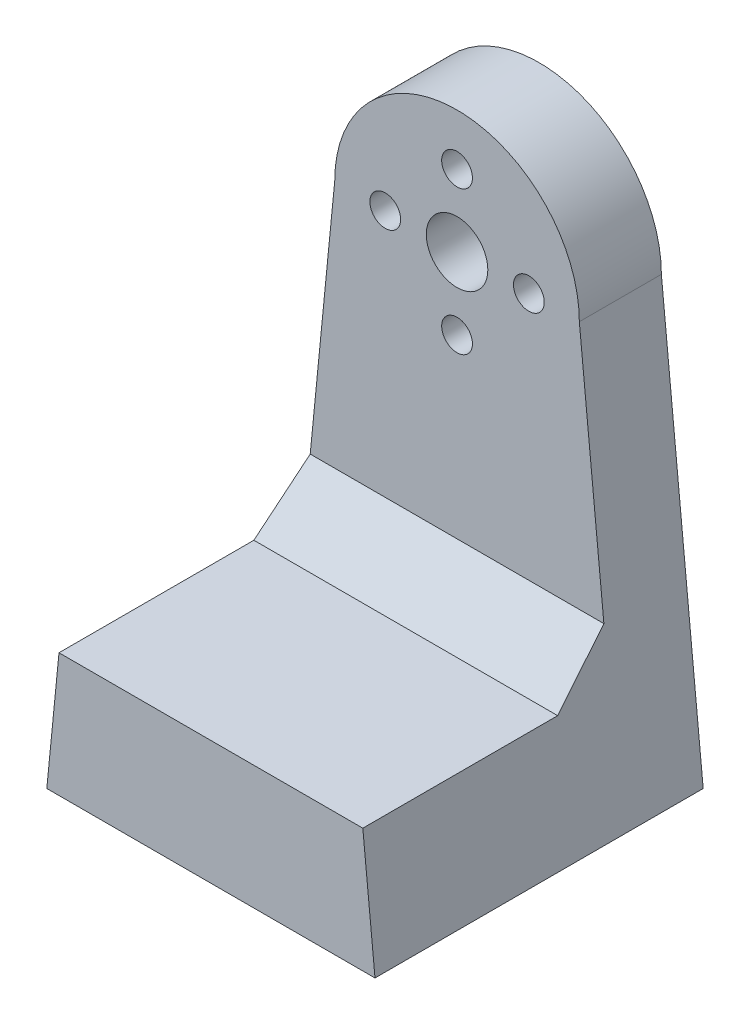
ISO-10303-21;
HEADER;
FILE_DESCRIPTION(('STEP AP214'),'2;1');
FILE_NAME('part.step','',(''),(''),'','','');
FILE_SCHEMA(('AUTOMOTIVE_DESIGN { 1 0 10303 214 1 1 1 1 }'));
ENDSEC;
DATA;
#1=APPLICATION_CONTEXT('core data for automotive mechanical design processes');
#2=APPLICATION_PROTOCOL_DEFINITION('international standard','automotive_design',2000,#1);
#3=PRODUCT_CONTEXT('',#1,'mechanical');
#4=PRODUCT('Part','Part','',(#3));
#5=PRODUCT_RELATED_PRODUCT_CATEGORY('part','',(#4));
#6=PRODUCT_DEFINITION_FORMATION('','',#4);
#7=PRODUCT_DEFINITION_CONTEXT('part definition',#1,'design');
#8=PRODUCT_DEFINITION('design','',#6,#7);
#9=PRODUCT_DEFINITION_SHAPE('','',#8);
#10=(LENGTH_UNIT() NAMED_UNIT(*) SI_UNIT(.MILLI.,.METRE.));
#11=(NAMED_UNIT(*) PLANE_ANGLE_UNIT() SI_UNIT($,.RADIAN.));
#12=(NAMED_UNIT(*) SI_UNIT($,.STERADIAN.) SOLID_ANGLE_UNIT());
#13=UNCERTAINTY_MEASURE_WITH_UNIT(LENGTH_MEASURE(1.E-05),#10,'distance_accuracy_value','');
#14=(GEOMETRIC_REPRESENTATION_CONTEXT(3) GLOBAL_UNCERTAINTY_ASSIGNED_CONTEXT((#13)) GLOBAL_UNIT_ASSIGNED_CONTEXT((#10,
#11,#12)) REPRESENTATION_CONTEXT('',''));
#15=CARTESIAN_POINT('',(0.,0.,0.));
#16=DIRECTION('',(0.,0.,1.));
#17=DIRECTION('',(1.,0.,0.));
#18=AXIS2_PLACEMENT_3D('',#15,#16,#17);
#19=CARTESIAN_POINT('',(-16.,42.,-16.));
#20=DIRECTION('',(0.,0.,1.));
#21=DIRECTION('',(1.,0.,0.));
#22=AXIS2_PLACEMENT_3D('',#19,#20,#21);
#23=PLANE('',#22);
#24=CARTESIAN_POINT('',(1.18218714507213E-06,48.2985575819751,-16.));
#25=DIRECTION('',(0.,0.,1.));
#26=DIRECTION('',(1.,0.,0.));
#27=AXIS2_PLACEMENT_3D('',#24,#25,#26);
#28=CIRCLE('',#27,1.5);
#29=CARTESIAN_POINT('',(1.50000118218715,48.2985575819751,-16.));
#30=VERTEX_POINT('',#29);
#31=EDGE_CURVE('E170',#30,#30,#28,.T.);
#32=ORIENTED_EDGE('',*,*,#31,.T.);
#33=EDGE_LOOP('',(#32));
#34=FACE_BOUND('',#33,.T.);
#35=CARTESIAN_POINT('',(7.00000000000006,41.2985563997881,-16.));
#36=DIRECTION('',(0.,0.,1.));
#37=DIRECTION('',(1.,0.,0.));
#38=AXIS2_PLACEMENT_3D('',#35,#36,#37);
#39=CIRCLE('',#38,1.5);
#40=CARTESIAN_POINT('',(8.50000000000006,41.2985563997881,-16.));
#41=VERTEX_POINT('',#40);
#42=EDGE_CURVE('E174',#41,#41,#39,.T.);
#43=ORIENTED_EDGE('',*,*,#42,.T.);
#44=EDGE_LOOP('',(#43));
#45=FACE_BOUND('',#44,.T.);
#46=CARTESIAN_POINT('',(-1.18218703128512E-06,34.2985575819751,-16.));
#47=DIRECTION('',(0.,0.,1.));
#48=DIRECTION('',(1.,0.,0.));
#49=AXIS2_PLACEMENT_3D('',#46,#47,#48);
#50=CIRCLE('',#49,1.5);
#51=CARTESIAN_POINT('',(1.49999881781297,34.2985575819751,-16.));
#52=VERTEX_POINT('',#51);
#53=EDGE_CURVE('E178',#52,#52,#50,.T.);
#54=ORIENTED_EDGE('',*,*,#53,.T.);
#55=EDGE_LOOP('',(#54));
#56=FACE_BOUND('',#55,.T.);
#57=CARTESIAN_POINT('',(-6.99999999999994,41.2985587641622,-16.));
#58=DIRECTION('',(0.,0.,1.));
#59=DIRECTION('',(1.,0.,0.));
#60=AXIS2_PLACEMENT_3D('',#57,#58,#59);
#61=CIRCLE('',#60,1.5);
#62=CARTESIAN_POINT('',(-5.49999999999994,41.2985587641622,-16.));
#63=VERTEX_POINT('',#62);
#64=EDGE_CURVE('E182',#63,#63,#61,.T.);
#65=ORIENTED_EDGE('',*,*,#64,.T.);
#66=EDGE_LOOP('',(#65));
#67=FACE_BOUND('',#66,.T.);
#68=CARTESIAN_POINT('',(0.,41.2985575819751,-16.));
#69=DIRECTION('',(0.,0.,1.));
#70=DIRECTION('',(1.,0.,0.));
#71=AXIS2_PLACEMENT_3D('',#68,#69,#70);
#72=CIRCLE('',#71,3.);
#73=CARTESIAN_POINT('',(3.00000000000006,41.2985575819751,-16.));
#74=VERTEX_POINT('',#73);
#75=EDGE_CURVE('E117',#74,#74,#72,.T.);
#76=ORIENTED_EDGE('',*,*,#75,.T.);
#77=EDGE_LOOP('',(#76));
#78=FACE_BOUND('',#77,.T.);
#79=DIRECTION('',(0.098069247945612,0.995179593142555,0.));
#80=VECTOR('',#79,1.);
#81=CARTESIAN_POINT('',(-16.,0.,-16.));
#82=LINE('',#81,#80);
#83=CARTESIAN_POINT('',(-16.,0.,-16.));
#84=VERTEX_POINT('',#83);
#85=CARTESIAN_POINT('',(-11.9226403852054,41.3759171967699,-16.));
#86=VERTEX_POINT('',#85);
#87=EDGE_CURVE('E110',#84,#86,#82,.T.);
#88=ORIENTED_EDGE('',*,*,#87,.T.);
#89=CARTESIAN_POINT('',(-1.59594559789866E-13,41.3759171967699,-16.));
#90=DIRECTION('',(0.,0.,-1.));
#91=DIRECTION('',(-1.,0.,0.));
#92=AXIS2_PLACEMENT_3D('',#89,#90,#91);
#93=CIRCLE('',#92,11.9226403852053);
#94=CARTESIAN_POINT('',(11.9226403852051,41.3759171967699,-16.));
#95=VERTEX_POINT('',#94);
#96=EDGE_CURVE('E108',#86,#95,#93,.T.);
#97=ORIENTED_EDGE('',*,*,#96,.T.);
#98=DIRECTION('',(0.0980692479456193,-0.995179593142555,0.));
#99=VECTOR('',#98,1.);
#100=CARTESIAN_POINT('',(16.,0.,-16.));
#101=LINE('',#100,#99);
#102=CARTESIAN_POINT('',(16.,0.,-16.));
#103=VERTEX_POINT('',#102);
#104=EDGE_CURVE('E48',#95,#103,#101,.T.);
#105=ORIENTED_EDGE('',*,*,#104,.T.);
#106=DIRECTION('',(-1.,0.,0.));
#107=VECTOR('',#106,1.);
#108=CARTESIAN_POINT('',(-16.,0.,-16.));
#109=LINE('',#108,#107);
#110=EDGE_CURVE('E147',#103,#84,#109,.T.);
#111=ORIENTED_EDGE('',*,*,#110,.T.);
#112=EDGE_LOOP('',(#88,#97,#105,#111));
#113=FACE_BOUND('',#112,.T.);
#114=ADVANCED_FACE('F34',(#34,#45,#56,#67,#78,#113),#23,.F.);
#115=CARTESIAN_POINT('',(-16.,42.,16.));
#116=DIRECTION('',(0.,0.,-1.));
#117=DIRECTION('',(-1.,0.,0.));
#118=AXIS2_PLACEMENT_3D('',#115,#116,#117);
#119=PLANE('',#118);
#120=DIRECTION('',(1.,0.,0.));
#121=VECTOR('',#120,1.);
#122=CARTESIAN_POINT('',(-26.,12.058,16.));
#123=LINE('',#122,#121);
#124=CARTESIAN_POINT('',(-14.8117531751289,12.058,16.));
#125=VERTEX_POINT('',#124);
#126=CARTESIAN_POINT('',(14.8117531751288,12.058,16.));
#127=VERTEX_POINT('',#126);
#128=EDGE_CURVE('E137',#125,#127,#123,.T.);
#129=ORIENTED_EDGE('',*,*,#128,.F.);
#130=DIRECTION('',(0.098069247945612,0.995179593142555,0.));
#131=VECTOR('',#130,1.);
#132=CARTESIAN_POINT('',(-16.,0.,16.));
#133=LINE('',#132,#131);
#134=CARTESIAN_POINT('',(-16.,0.,16.));
#135=VERTEX_POINT('',#134);
#136=EDGE_CURVE('E124',#135,#125,#133,.T.);
#137=ORIENTED_EDGE('',*,*,#136,.F.);
#138=DIRECTION('',(1.,0.,0.));
#139=VECTOR('',#138,1.);
#140=CARTESIAN_POINT('',(-16.,0.,16.));
#141=LINE('',#140,#139);
#142=CARTESIAN_POINT('',(16.,0.,16.));
#143=VERTEX_POINT('',#142);
#144=EDGE_CURVE('E11',#135,#143,#141,.T.);
#145=ORIENTED_EDGE('',*,*,#144,.T.);
#146=DIRECTION('',(0.0980692479456193,-0.995179593142555,0.));
#147=VECTOR('',#146,1.);
#148=CARTESIAN_POINT('',(16.,0.,16.));
#149=LINE('',#148,#147);
#150=EDGE_CURVE('E114',#127,#143,#149,.T.);
#151=ORIENTED_EDGE('',*,*,#150,.F.);
#152=EDGE_LOOP('',(#129,#137,#145,#151));
#153=FACE_BOUND('',#152,.T.);
#154=ADVANCED_FACE('F156',(#153),#119,.F.);
#155=CARTESIAN_POINT('',(0.,0.,0.));
#156=DIRECTION('',(0.,-1.,0.));
#157=DIRECTION('',(0.,0.,-1.));
#158=AXIS2_PLACEMENT_3D('',#155,#156,#157);
#159=PLANE('',#158);
#160=CARTESIAN_POINT('',(-8.,0.,7.5));
#161=DIRECTION('',(0.,-1.,0.));
#162=DIRECTION('',(0.,0.,-1.));
#163=AXIS2_PLACEMENT_3D('',#160,#161,#162);
#164=CIRCLE('',#163,2.05);
#165=CARTESIAN_POINT('',(-8.,0.,5.45));
#166=VERTEX_POINT('',#165);
#167=EDGE_CURVE('E211',#166,#166,#164,.T.);
#168=ORIENTED_EDGE('',*,*,#167,.F.);
#169=EDGE_LOOP('',(#168));
#170=FACE_BOUND('',#169,.T.);
#171=CARTESIAN_POINT('',(8.,0.,7.5));
#172=DIRECTION('',(0.,-1.,0.));
#173=DIRECTION('',(0.,0.,-1.));
#174=AXIS2_PLACEMENT_3D('',#171,#172,#173);
#175=CIRCLE('',#174,2.05);
#176=CARTESIAN_POINT('',(8.,0.,5.45));
#177=VERTEX_POINT('',#176);
#178=EDGE_CURVE('E205',#177,#177,#175,.T.);
#179=ORIENTED_EDGE('',*,*,#178,.F.);
#180=EDGE_LOOP('',(#179));
#181=FACE_BOUND('',#180,.T.);
#182=DIRECTION('',(0.,0.,-1.));
#183=VECTOR('',#182,1.);
#184=CARTESIAN_POINT('',(16.,0.,16.));
#185=LINE('',#184,#183);
#186=EDGE_CURVE('E140',#143,#103,#185,.T.);
#187=ORIENTED_EDGE('',*,*,#186,.F.);
#188=ORIENTED_EDGE('',*,*,#144,.F.);
#189=DIRECTION('',(0.,0.,1.));
#190=VECTOR('',#189,1.);
#191=CARTESIAN_POINT('',(-16.,0.,16.));
#192=LINE('',#191,#190);
#193=EDGE_CURVE('E41',#84,#135,#192,.T.);
#194=ORIENTED_EDGE('',*,*,#193,.F.);
#195=ORIENTED_EDGE('',*,*,#110,.F.);
#196=EDGE_LOOP('',(#187,#188,#194,#195));
#197=FACE_BOUND('',#196,.T.);
#198=ADVANCED_FACE('F159',(#170,#181,#197),#159,.T.);
#199=CARTESIAN_POINT('',(-26.,12.058,-3.));
#200=DIRECTION('',(0.,-0.705417607223476,-0.708791929566855));
#201=DIRECTION('',(0.,0.708791929566855,-0.705417607223476));
#202=AXIS2_PLACEMENT_3D('',#199,#200,#201);
#203=PLANE('',#202);
#204=DIRECTION('',(1.,0.,0.));
#205=VECTOR('',#204,1.);
#206=CARTESIAN_POINT('',(-26.,17.0819171967699,-8.));
#207=LINE('',#206,#205);
#208=CARTESIAN_POINT('',(-14.3166749152618,17.0819171967699,-8.));
#209=VERTEX_POINT('',#208);
#210=CARTESIAN_POINT('',(14.3166749152617,17.0819171967699,-8.));
#211=VERTEX_POINT('',#210);
#212=EDGE_CURVE('E138',#209,#211,#207,.T.);
#213=ORIENTED_EDGE('',*,*,#212,.F.);
#214=DIRECTION('',(-0.0696776244724187,-0.707069253881273,0.703703132623169));
#215=VECTOR('',#214,1.);
#216=CARTESIAN_POINT('',(-14.8660717929441,11.5067896959568,-2.451413824657));
#217=LINE('',#216,#215);
#218=CARTESIAN_POINT('',(-14.8117531751289,12.058,-3.));
#219=VERTEX_POINT('',#218);
#220=EDGE_CURVE('E95',#209,#219,#217,.T.);
#221=ORIENTED_EDGE('',*,*,#220,.T.);
#222=DIRECTION('',(1.,0.,0.));
#223=VECTOR('',#222,1.);
#224=CARTESIAN_POINT('',(-26.,12.058,-3.));
#225=LINE('',#224,#223);
#226=CARTESIAN_POINT('',(14.8117531751288,12.058,-3.));
#227=VERTEX_POINT('',#226);
#228=EDGE_CURVE('E141',#219,#227,#225,.T.);
#229=ORIENTED_EDGE('',*,*,#228,.T.);
#230=DIRECTION('',(-0.069677624472424,0.707069253881272,-0.703703132623168));
#231=VECTOR('',#230,1.);
#232=CARTESIAN_POINT('',(14.6136132826337,14.0686688052495,-5.0010966806362));
#233=LINE('',#232,#231);
#234=EDGE_CURVE('E130',#227,#211,#233,.T.);
#235=ORIENTED_EDGE('',*,*,#234,.T.);
#236=EDGE_LOOP('',(#213,#221,#229,#235));
#237=FACE_BOUND('',#236,.T.);
#238=ADVANCED_FACE('F228',(#237),#203,.F.);
#239=CARTESIAN_POINT('',(-26.,12.058,16.));
#240=DIRECTION('',(0.,-1.,0.));
#241=DIRECTION('',(0.,0.,-1.));
#242=AXIS2_PLACEMENT_3D('',#239,#240,#241);
#243=PLANE('',#242);
#244=ORIENTED_EDGE('',*,*,#228,.F.);
#245=DIRECTION('',(0.,0.,1.));
#246=VECTOR('',#245,1.);
#247=CARTESIAN_POINT('',(-14.8117531751289,12.058,16.));
#248=LINE('',#247,#246);
#249=EDGE_CURVE('E56',#219,#125,#248,.T.);
#250=ORIENTED_EDGE('',*,*,#249,.T.);
#251=ORIENTED_EDGE('',*,*,#128,.T.);
#252=DIRECTION('',(0.,0.,-1.));
#253=VECTOR('',#252,1.);
#254=CARTESIAN_POINT('',(14.8117531751288,12.058,16.));
#255=LINE('',#254,#253);
#256=EDGE_CURVE('E100',#127,#227,#255,.T.);
#257=ORIENTED_EDGE('',*,*,#256,.T.);
#258=EDGE_LOOP('',(#244,#250,#251,#257));
#259=FACE_BOUND('',#258,.T.);
#260=ADVANCED_FACE('F270',(#259),#243,.F.);
#261=CARTESIAN_POINT('',(-26.,17.0819171967699,-8.));
#262=DIRECTION('',(0.,0.,-1.));
#263=DIRECTION('',(-1.,0.,0.));
#264=AXIS2_PLACEMENT_3D('',#261,#262,#263);
#265=PLANE('',#264);
#266=CARTESIAN_POINT('',(1.18218714507213E-06,48.2985575819751,-8.));
#267=DIRECTION('',(0.,0.,1.));
#268=DIRECTION('',(1.,0.,0.));
#269=AXIS2_PLACEMENT_3D('',#266,#267,#268);
#270=CIRCLE('',#269,1.5);
#271=CARTESIAN_POINT('',(1.50000118218715,48.2985575819751,-8.));
#272=VERTEX_POINT('',#271);
#273=EDGE_CURVE('E192',#272,#272,#270,.T.);
#274=ORIENTED_EDGE('',*,*,#273,.F.);
#275=EDGE_LOOP('',(#274));
#276=FACE_BOUND('',#275,.T.);
#277=CARTESIAN_POINT('',(7.00000000000006,41.2985563997881,-8.));
#278=DIRECTION('',(0.,0.,1.));
#279=DIRECTION('',(1.,0.,0.));
#280=AXIS2_PLACEMENT_3D('',#277,#278,#279);
#281=CIRCLE('',#280,1.5);
#282=CARTESIAN_POINT('',(8.50000000000006,41.2985563997881,-8.));
#283=VERTEX_POINT('',#282);
#284=EDGE_CURVE('E188',#283,#283,#281,.T.);
#285=ORIENTED_EDGE('',*,*,#284,.F.);
#286=EDGE_LOOP('',(#285));
#287=FACE_BOUND('',#286,.T.);
#288=CARTESIAN_POINT('',(-1.18218703128512E-06,34.2985575819751,-8.));
#289=DIRECTION('',(0.,0.,1.));
#290=DIRECTION('',(1.,0.,0.));
#291=AXIS2_PLACEMENT_3D('',#288,#289,#290);
#292=CIRCLE('',#291,1.5);
#293=CARTESIAN_POINT('',(1.49999881781297,34.2985575819751,-8.));
#294=VERTEX_POINT('',#293);
#295=EDGE_CURVE('E201',#294,#294,#292,.T.);
#296=ORIENTED_EDGE('',*,*,#295,.F.);
#297=EDGE_LOOP('',(#296));
#298=FACE_BOUND('',#297,.T.);
#299=CARTESIAN_POINT('',(-6.99999999999994,41.2985587641622,-8.));
#300=DIRECTION('',(0.,0.,1.));
#301=DIRECTION('',(1.,0.,0.));
#302=AXIS2_PLACEMENT_3D('',#299,#300,#301);
#303=CIRCLE('',#302,1.5);
#304=CARTESIAN_POINT('',(-5.49999999999994,41.2985587641622,-8.));
#305=VERTEX_POINT('',#304);
#306=EDGE_CURVE('E196',#305,#305,#303,.T.);
#307=ORIENTED_EDGE('',*,*,#306,.F.);
#308=EDGE_LOOP('',(#307));
#309=FACE_BOUND('',#308,.T.);
#310=CARTESIAN_POINT('',(0.,41.2985575819751,-8.));
#311=DIRECTION('',(0.,0.,1.));
#312=DIRECTION('',(1.,0.,0.));
#313=AXIS2_PLACEMENT_3D('',#310,#311,#312);
#314=CIRCLE('',#313,3.);
#315=CARTESIAN_POINT('',(3.00000000000006,41.2985575819751,-8.));
#316=VERTEX_POINT('',#315);
#317=EDGE_CURVE('E120',#316,#316,#314,.T.);
#318=ORIENTED_EDGE('',*,*,#317,.F.);
#319=EDGE_LOOP('',(#318));
#320=FACE_BOUND('',#319,.T.);
#321=DIRECTION('',(-0.0980692479456194,0.995179593142555,0.));
#322=VECTOR('',#321,1.);
#323=CARTESIAN_POINT('',(13.9289261740511,21.016684135469,-8.));
#324=LINE('',#323,#322);
#325=CARTESIAN_POINT('',(11.9226403852051,41.3759171967699,-8.));
#326=VERTEX_POINT('',#325);
#327=EDGE_CURVE('E109',#211,#326,#324,.T.);
#328=ORIENTED_EDGE('',*,*,#327,.T.);
#329=CARTESIAN_POINT('',(-1.59594559789866E-13,41.3759171967699,-8.));
#330=DIRECTION('',(0.,0.,-1.));
#331=DIRECTION('',(-1.,0.,0.));
#332=AXIS2_PLACEMENT_3D('',#329,#330,#331);
#333=CIRCLE('',#332,11.9226403852053);
#334=CARTESIAN_POINT('',(-11.9226403852054,41.3759171967699,-8.));
#335=VERTEX_POINT('',#334);
#336=EDGE_CURVE('E106',#335,#326,#333,.T.);
#337=ORIENTED_EDGE('',*,*,#336,.F.);
#338=DIRECTION('',(-0.098069247945612,-0.995179593142555,0.));
#339=VECTOR('',#338,1.);
#340=CARTESIAN_POINT('',(-14.4290401984674,15.9416653934125,-8.));
#341=LINE('',#340,#339);
#342=EDGE_CURVE('E90',#335,#209,#341,.T.);
#343=ORIENTED_EDGE('',*,*,#342,.T.);
#344=ORIENTED_EDGE('',*,*,#212,.T.);
#345=EDGE_LOOP('',(#328,#337,#343,#344));
#346=FACE_BOUND('',#345,.T.);
#347=ADVANCED_FACE('F113',(#276,#287,#298,#309,#320,#346),#265,.F.);
#348=CARTESIAN_POINT('',(16.,0.,-16.));
#349=DIRECTION('',(-0.995179593142555,-0.0980692479456194,0.));
#350=DIRECTION('',(0.0980692479456194,-0.995179593142555,0.));
#351=AXIS2_PLACEMENT_3D('',#348,#349,#350);
#352=PLANE('',#351);
#353=ORIENTED_EDGE('',*,*,#150,.T.);
#354=ORIENTED_EDGE('',*,*,#186,.T.);
#355=ORIENTED_EDGE('',*,*,#104,.F.);
#356=DIRECTION('',(0.,0.,1.));
#357=VECTOR('',#356,1.);
#358=CARTESIAN_POINT('',(11.9226403852051,41.3759171967699,-16.));
#359=LINE('',#358,#357);
#360=EDGE_CURVE('E125',#95,#326,#359,.T.);
#361=ORIENTED_EDGE('',*,*,#360,.T.);
#362=ORIENTED_EDGE('',*,*,#327,.F.);
#363=ORIENTED_EDGE('',*,*,#234,.F.);
#364=ORIENTED_EDGE('',*,*,#256,.F.);
#365=EDGE_LOOP('',(#353,#354,#355,#361,#362,#363,#364));
#366=FACE_BOUND('',#365,.T.);
#367=ADVANCED_FACE('F160',(#366),#352,.F.);
#368=CARTESIAN_POINT('',(-16.,0.,-16.));
#369=DIRECTION('',(0.995179593142555,-0.098069247945612,0.));
#370=DIRECTION('',(0.098069247945612,0.995179593142556,0.));
#371=AXIS2_PLACEMENT_3D('',#368,#369,#370);
#372=PLANE('',#371);
#373=ORIENTED_EDGE('',*,*,#220,.F.);
#374=ORIENTED_EDGE('',*,*,#342,.F.);
#375=DIRECTION('',(0.,0.,1.));
#376=VECTOR('',#375,1.);
#377=CARTESIAN_POINT('',(-11.9226403852054,41.3759171967699,-16.));
#378=LINE('',#377,#376);
#379=EDGE_CURVE('E93',#86,#335,#378,.T.);
#380=ORIENTED_EDGE('',*,*,#379,.F.);
#381=ORIENTED_EDGE('',*,*,#87,.F.);
#382=ORIENTED_EDGE('',*,*,#193,.T.);
#383=ORIENTED_EDGE('',*,*,#136,.T.);
#384=ORIENTED_EDGE('',*,*,#249,.F.);
#385=EDGE_LOOP('',(#373,#374,#380,#381,#382,#383,#384));
#386=FACE_BOUND('',#385,.T.);
#387=ADVANCED_FACE('F92',(#386),#372,.F.);
#388=CARTESIAN_POINT('',(-1.59594559789866E-13,41.3759171967699,-8.));
#389=DIRECTION('',(0.,0.,-1.));
#390=DIRECTION('',(-1.,0.,0.));
#391=AXIS2_PLACEMENT_3D('',#388,#389,#390);
#392=CYLINDRICAL_SURFACE('',#391,11.9226403852053);
#393=ORIENTED_EDGE('',*,*,#360,.F.);
#394=ORIENTED_EDGE('',*,*,#96,.F.);
#395=ORIENTED_EDGE('',*,*,#379,.T.);
#396=ORIENTED_EDGE('',*,*,#336,.T.);
#397=EDGE_LOOP('',(#393,#394,#395,#396));
#398=FACE_BOUND('',#397,.T.);
#399=ADVANCED_FACE('F105',(#398),#392,.T.);
#400=CARTESIAN_POINT('',(0.,41.2985575819751,-16.));
#401=DIRECTION('',(0.,0.,1.));
#402=DIRECTION('',(1.,0.,0.));
#403=AXIS2_PLACEMENT_3D('',#400,#401,#402);
#404=CYLINDRICAL_SURFACE('',#403,3.);
#405=ORIENTED_EDGE('',*,*,#75,.F.);
#406=EDGE_LOOP('',(#405));
#407=FACE_BOUND('',#406,.T.);
#408=ORIENTED_EDGE('',*,*,#317,.T.);
#409=EDGE_LOOP('',(#408));
#410=FACE_BOUND('',#409,.T.);
#411=ADVANCED_FACE('F254',(#407,#410),#404,.F.);
#412=CARTESIAN_POINT('',(-6.99999999999994,41.2985587641622,-16.));
#413=DIRECTION('',(0.,0.,1.));
#414=DIRECTION('',(1.,0.,0.));
#415=AXIS2_PLACEMENT_3D('',#412,#413,#414);
#416=CYLINDRICAL_SURFACE('',#415,1.5);
#417=ORIENTED_EDGE('',*,*,#64,.F.);
#418=EDGE_LOOP('',(#417));
#419=FACE_BOUND('',#418,.T.);
#420=ORIENTED_EDGE('',*,*,#306,.T.);
#421=EDGE_LOOP('',(#420));
#422=FACE_BOUND('',#421,.T.);
#423=ADVANCED_FACE('F251',(#419,#422),#416,.F.);
#424=CARTESIAN_POINT('',(-1.18218703128512E-06,34.2985575819751,-16.));
#425=DIRECTION('',(0.,0.,1.));
#426=DIRECTION('',(1.,0.,0.));
#427=AXIS2_PLACEMENT_3D('',#424,#425,#426);
#428=CYLINDRICAL_SURFACE('',#427,1.5);
#429=ORIENTED_EDGE('',*,*,#53,.F.);
#430=EDGE_LOOP('',(#429));
#431=FACE_BOUND('',#430,.T.);
#432=ORIENTED_EDGE('',*,*,#295,.T.);
#433=EDGE_LOOP('',(#432));
#434=FACE_BOUND('',#433,.T.);
#435=ADVANCED_FACE('F248',(#431,#434),#428,.F.);
#436=CARTESIAN_POINT('',(7.00000000000006,41.2985563997881,-16.));
#437=DIRECTION('',(0.,0.,1.));
#438=DIRECTION('',(1.,0.,0.));
#439=AXIS2_PLACEMENT_3D('',#436,#437,#438);
#440=CYLINDRICAL_SURFACE('',#439,1.5);
#441=ORIENTED_EDGE('',*,*,#42,.F.);
#442=EDGE_LOOP('',(#441));
#443=FACE_BOUND('',#442,.T.);
#444=ORIENTED_EDGE('',*,*,#284,.T.);
#445=EDGE_LOOP('',(#444));
#446=FACE_BOUND('',#445,.T.);
#447=ADVANCED_FACE('F243',(#443,#446),#440,.F.);
#448=CARTESIAN_POINT('',(1.18218714507213E-06,48.2985575819751,-16.));
#449=DIRECTION('',(0.,0.,1.));
#450=DIRECTION('',(1.,0.,0.));
#451=AXIS2_PLACEMENT_3D('',#448,#449,#450);
#452=CYLINDRICAL_SURFACE('',#451,1.5);
#453=ORIENTED_EDGE('',*,*,#31,.F.);
#454=EDGE_LOOP('',(#453));
#455=FACE_BOUND('',#454,.T.);
#456=ORIENTED_EDGE('',*,*,#273,.T.);
#457=EDGE_LOOP('',(#456));
#458=FACE_BOUND('',#457,.T.);
#459=ADVANCED_FACE('F234',(#455,#458),#452,.F.);
#460=CARTESIAN_POINT('',(8.,6.,7.5));
#461=DIRECTION('',(0.,-1.,0.));
#462=DIRECTION('',(0.,0.,-1.));
#463=AXIS2_PLACEMENT_3D('',#460,#461,#462);
#464=CYLINDRICAL_SURFACE('',#463,2.05);
#465=CARTESIAN_POINT('',(8.,6.,7.5));
#466=DIRECTION('',(0.,-1.,0.));
#467=DIRECTION('',(0.,0.,-1.));
#468=AXIS2_PLACEMENT_3D('',#465,#466,#467);
#469=CIRCLE('',#468,2.05);
#470=CARTESIAN_POINT('',(8.,6.,5.45));
#471=VERTEX_POINT('',#470);
#472=EDGE_CURVE('E208',#471,#471,#469,.T.);
#473=ORIENTED_EDGE('',*,*,#472,.F.);
#474=EDGE_LOOP('',(#473));
#475=FACE_BOUND('',#474,.T.);
#476=ORIENTED_EDGE('',*,*,#178,.T.);
#477=EDGE_LOOP('',(#476));
#478=FACE_BOUND('',#477,.T.);
#479=ADVANCED_FACE('F232',(#475,#478),#464,.F.);
#480=CARTESIAN_POINT('',(8.,6.,7.5));
#481=DIRECTION('',(0.,-1.,0.));
#482=DIRECTION('',(0.,0.,-1.));
#483=AXIS2_PLACEMENT_3D('',#480,#481,#482);
#484=PLANE('',#483);
#485=ORIENTED_EDGE('',*,*,#472,.T.);
#486=EDGE_LOOP('',(#485));
#487=FACE_BOUND('',#486,.T.);
#488=ADVANCED_FACE('F222',(#487),#484,.T.);
#489=CARTESIAN_POINT('',(-8.,6.,7.5));
#490=DIRECTION('',(0.,-1.,0.));
#491=DIRECTION('',(0.,0.,-1.));
#492=AXIS2_PLACEMENT_3D('',#489,#490,#491);
#493=CYLINDRICAL_SURFACE('',#492,2.05);
#494=CARTESIAN_POINT('',(-8.,6.,7.5));
#495=DIRECTION('',(0.,-1.,0.));
#496=DIRECTION('',(0.,0.,-1.));
#497=AXIS2_PLACEMENT_3D('',#494,#495,#496);
#498=CIRCLE('',#497,2.05);
#499=CARTESIAN_POINT('',(-8.,6.,5.45));
#500=VERTEX_POINT('',#499);
#501=EDGE_CURVE('E199',#500,#500,#498,.T.);
#502=ORIENTED_EDGE('',*,*,#501,.F.);
#503=EDGE_LOOP('',(#502));
#504=FACE_BOUND('',#503,.T.);
#505=ORIENTED_EDGE('',*,*,#167,.T.);
#506=EDGE_LOOP('',(#505));
#507=FACE_BOUND('',#506,.T.);
#508=ADVANCED_FACE('F219',(#504,#507),#493,.F.);
#509=CARTESIAN_POINT('',(-8.,6.,7.5));
#510=DIRECTION('',(0.,-1.,0.));
#511=DIRECTION('',(0.,0.,-1.));
#512=AXIS2_PLACEMENT_3D('',#509,#510,#511);
#513=PLANE('',#512);
#514=ORIENTED_EDGE('',*,*,#501,.T.);
#515=EDGE_LOOP('',(#514));
#516=FACE_BOUND('',#515,.T.);
#517=ADVANCED_FACE('F217',(#516),#513,.T.);
#518=CLOSED_SHELL('',(#114,#154,#198,#238,#260,#347,#367,#387,#399,#411,#423,#435,#447,#459,
#479,#488,#508,#517));
#519=MANIFOLD_SOLID_BREP('B2',#518);
#520=ADVANCED_BREP_SHAPE_REPRESENTATION('',(#18,#519),#14);
#521=SHAPE_DEFINITION_REPRESENTATION(#9,#520);
ENDSEC;
END-ISO-10303-21;
